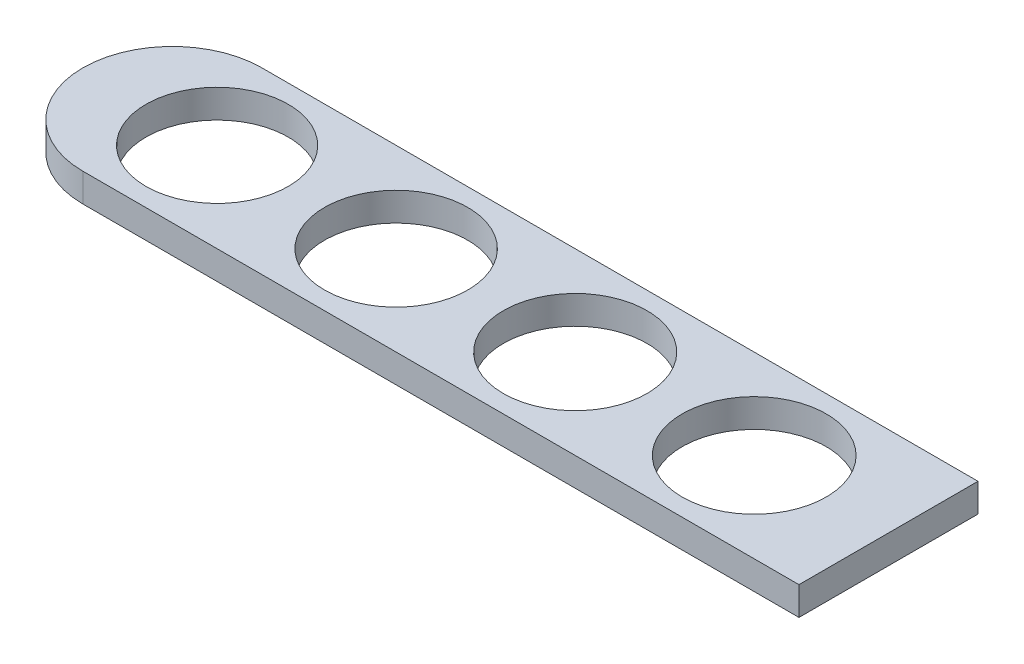
ISO-10303-21;
HEADER;
FILE_DESCRIPTION(('STEP AP214'),'2;1');
FILE_NAME('part.step','',(''),(''),'','','');
FILE_SCHEMA(('AUTOMOTIVE_DESIGN { 1 0 10303 214 1 1 1 1 }'));
ENDSEC;
DATA;
#1=APPLICATION_CONTEXT('core data for automotive mechanical design processes');
#2=APPLICATION_PROTOCOL_DEFINITION('international standard','automotive_design',2000,#1);
#3=PRODUCT_CONTEXT('',#1,'mechanical');
#4=PRODUCT('Part','Part','',(#3));
#5=PRODUCT_RELATED_PRODUCT_CATEGORY('part','',(#4));
#6=PRODUCT_DEFINITION_FORMATION('','',#4);
#7=PRODUCT_DEFINITION_CONTEXT('part definition',#1,'design');
#8=PRODUCT_DEFINITION('design','',#6,#7);
#9=PRODUCT_DEFINITION_SHAPE('','',#8);
#10=(LENGTH_UNIT() NAMED_UNIT(*) SI_UNIT(.MILLI.,.METRE.));
#11=(NAMED_UNIT(*) PLANE_ANGLE_UNIT() SI_UNIT($,.RADIAN.));
#12=(NAMED_UNIT(*) SI_UNIT($,.STERADIAN.) SOLID_ANGLE_UNIT());
#13=UNCERTAINTY_MEASURE_WITH_UNIT(LENGTH_MEASURE(1.E-05),#10,'distance_accuracy_value','');
#14=(GEOMETRIC_REPRESENTATION_CONTEXT(3) GLOBAL_UNCERTAINTY_ASSIGNED_CONTEXT((#13)) GLOBAL_UNIT_ASSIGNED_CONTEXT((#10,
#11,#12)) REPRESENTATION_CONTEXT('',''));
#15=CARTESIAN_POINT('',(0.,0.,0.));
#16=DIRECTION('',(0.,0.,1.));
#17=DIRECTION('',(1.,0.,0.));
#18=AXIS2_PLACEMENT_3D('',#15,#16,#17);
#19=CARTESIAN_POINT('',(0.,3.175,0.));
#20=DIRECTION('',(0.,1.,0.));
#21=DIRECTION('',(0.,0.,1.));
#22=AXIS2_PLACEMENT_3D('',#19,#20,#21);
#23=PLANE('',#22);
#24=CARTESIAN_POINT('',(10.,3.175,0.));
#25=DIRECTION('',(0.,1.,0.));
#26=DIRECTION('',(0.,0.,1.));
#27=AXIS2_PLACEMENT_3D('',#24,#25,#26);
#28=CIRCLE('',#27,8.025);
#29=CARTESIAN_POINT('',(10.,3.175,8.025));
#30=VERTEX_POINT('',#29);
#31=EDGE_CURVE('E132',#30,#30,#28,.T.);
#32=ORIENTED_EDGE('',*,*,#31,.F.);
#33=EDGE_LOOP('',(#32));
#34=FACE_BOUND('',#33,.T.);
#35=CARTESIAN_POINT('',(-30.,3.175,0.));
#36=DIRECTION('',(0.,1.,0.));
#37=DIRECTION('',(0.,0.,1.));
#38=AXIS2_PLACEMENT_3D('',#35,#36,#37);
#39=CIRCLE('',#38,7.95);
#40=CARTESIAN_POINT('',(-30.,3.175,7.95));
#41=VERTEX_POINT('',#40);
#42=EDGE_CURVE('E144',#41,#41,#39,.T.);
#43=ORIENTED_EDGE('',*,*,#42,.F.);
#44=EDGE_LOOP('',(#43));
#45=FACE_BOUND('',#44,.T.);
#46=DIRECTION('',(-1.,0.,0.));
#47=VECTOR('',#46,1.);
#48=CARTESIAN_POINT('',(-45.,3.175,-10.));
#49=LINE('',#48,#47);
#50=CARTESIAN_POINT('',(45.,3.175,-10.));
#51=VERTEX_POINT('',#50);
#52=CARTESIAN_POINT('',(-35.,3.175,-10.));
#53=VERTEX_POINT('',#52);
#54=EDGE_CURVE('E76',#51,#53,#49,.T.);
#55=ORIENTED_EDGE('',*,*,#54,.T.);
#56=CARTESIAN_POINT('',(-35.,3.175,0.));
#57=DIRECTION('',(0.,1.,0.));
#58=DIRECTION('',(0.,0.,1.));
#59=AXIS2_PLACEMENT_3D('',#56,#57,#58);
#60=CIRCLE('',#59,10.);
#61=CARTESIAN_POINT('',(-45.,3.175,0.));
#62=VERTEX_POINT('',#61);
#63=EDGE_CURVE('E41',#53,#62,#60,.T.);
#64=ORIENTED_EDGE('',*,*,#63,.T.);
#65=CARTESIAN_POINT('',(-35.,3.175,0.));
#66=DIRECTION('',(0.,1.,0.));
#67=DIRECTION('',(0.,0.,1.));
#68=AXIS2_PLACEMENT_3D('',#65,#66,#67);
#69=CIRCLE('',#68,10.);
#70=CARTESIAN_POINT('',(-35.,3.175,10.));
#71=VERTEX_POINT('',#70);
#72=EDGE_CURVE('E48',#62,#71,#69,.T.);
#73=ORIENTED_EDGE('',*,*,#72,.T.);
#74=DIRECTION('',(1.,0.,0.));
#75=VECTOR('',#74,1.);
#76=CARTESIAN_POINT('',(-45.,3.175,10.));
#77=LINE('',#76,#75);
#78=CARTESIAN_POINT('',(45.,3.175,10.));
#79=VERTEX_POINT('',#78);
#80=EDGE_CURVE('E85',#71,#79,#77,.T.);
#81=ORIENTED_EDGE('',*,*,#80,.T.);
#82=DIRECTION('',(0.,0.,-1.));
#83=VECTOR('',#82,1.);
#84=CARTESIAN_POINT('',(45.,3.175,-10.));
#85=LINE('',#84,#83);
#86=EDGE_CURVE('E86',#79,#51,#85,.T.);
#87=ORIENTED_EDGE('',*,*,#86,.T.);
#88=EDGE_LOOP('',(#55,#64,#73,#81,#87));
#89=FACE_BOUND('',#88,.T.);
#90=CARTESIAN_POINT('',(-10.,3.175,0.));
#91=DIRECTION('',(0.,1.,0.));
#92=DIRECTION('',(0.,0.,1.));
#93=AXIS2_PLACEMENT_3D('',#90,#91,#92);
#94=CIRCLE('',#93,8.);
#95=CARTESIAN_POINT('',(-10.,3.175,8.));
#96=VERTEX_POINT('',#95);
#97=EDGE_CURVE('E138',#96,#96,#94,.T.);
#98=ORIENTED_EDGE('',*,*,#97,.F.);
#99=EDGE_LOOP('',(#98));
#100=FACE_BOUND('',#99,.T.);
#101=CARTESIAN_POINT('',(30.,3.175,0.));
#102=DIRECTION('',(0.,1.,0.));
#103=DIRECTION('',(0.,0.,1.));
#104=AXIS2_PLACEMENT_3D('',#101,#102,#103);
#105=CIRCLE('',#104,8.05);
#106=CARTESIAN_POINT('',(30.,3.175,8.05));
#107=VERTEX_POINT('',#106);
#108=EDGE_CURVE('E124',#107,#107,#105,.T.);
#109=ORIENTED_EDGE('',*,*,#108,.F.);
#110=EDGE_LOOP('',(#109));
#111=FACE_BOUND('',#110,.T.);
#112=ADVANCED_FACE('F32',(#34,#45,#89,#100,#111),#23,.T.);
#113=CARTESIAN_POINT('',(0.,0.,0.));
#114=DIRECTION('',(0.,1.,0.));
#115=DIRECTION('',(0.,0.,1.));
#116=AXIS2_PLACEMENT_3D('',#113,#114,#115);
#117=PLANE('',#116);
#118=CARTESIAN_POINT('',(-35.,0.,0.));
#119=DIRECTION('',(0.,1.,0.));
#120=DIRECTION('',(0.,0.,1.));
#121=AXIS2_PLACEMENT_3D('',#118,#119,#120);
#122=CIRCLE('',#121,10.);
#123=CARTESIAN_POINT('',(-35.,0.,10.));
#124=VERTEX_POINT('',#123);
#125=CARTESIAN_POINT('',(-45.,0.,0.));
#126=VERTEX_POINT('',#125);
#127=EDGE_CURVE('E98',#124,#126,#122,.F.);
#128=ORIENTED_EDGE('',*,*,#127,.T.);
#129=CARTESIAN_POINT('',(-35.,0.,0.));
#130=DIRECTION('',(0.,1.,0.));
#131=DIRECTION('',(0.,0.,1.));
#132=AXIS2_PLACEMENT_3D('',#129,#130,#131);
#133=CIRCLE('',#132,10.);
#134=CARTESIAN_POINT('',(-35.,0.,-10.));
#135=VERTEX_POINT('',#134);
#136=EDGE_CURVE('E101',#126,#135,#133,.F.);
#137=ORIENTED_EDGE('',*,*,#136,.T.);
#138=DIRECTION('',(-1.,0.,0.));
#139=VECTOR('',#138,1.);
#140=CARTESIAN_POINT('',(-45.,0.,-10.));
#141=LINE('',#140,#139);
#142=CARTESIAN_POINT('',(45.,0.,-10.));
#143=VERTEX_POINT('',#142);
#144=EDGE_CURVE('E113',#143,#135,#141,.T.);
#145=ORIENTED_EDGE('',*,*,#144,.F.);
#146=DIRECTION('',(0.,0.,-1.));
#147=VECTOR('',#146,1.);
#148=CARTESIAN_POINT('',(45.,0.,-10.));
#149=LINE('',#148,#147);
#150=CARTESIAN_POINT('',(45.,0.,10.));
#151=VERTEX_POINT('',#150);
#152=EDGE_CURVE('E97',#151,#143,#149,.T.);
#153=ORIENTED_EDGE('',*,*,#152,.F.);
#154=DIRECTION('',(1.,0.,0.));
#155=VECTOR('',#154,1.);
#156=CARTESIAN_POINT('',(-45.,0.,10.));
#157=LINE('',#156,#155);
#158=EDGE_CURVE('E93',#124,#151,#157,.T.);
#159=ORIENTED_EDGE('',*,*,#158,.F.);
#160=EDGE_LOOP('',(#128,#137,#145,#153,#159));
#161=FACE_BOUND('',#160,.T.);
#162=CARTESIAN_POINT('',(-30.,0.,0.));
#163=DIRECTION('',(0.,1.,0.));
#164=DIRECTION('',(0.,0.,1.));
#165=AXIS2_PLACEMENT_3D('',#162,#163,#164);
#166=CIRCLE('',#165,7.95);
#167=CARTESIAN_POINT('',(-30.,0.,7.95));
#168=VERTEX_POINT('',#167);
#169=EDGE_CURVE('E141',#168,#168,#166,.T.);
#170=ORIENTED_EDGE('',*,*,#169,.T.);
#171=EDGE_LOOP('',(#170));
#172=FACE_BOUND('',#171,.T.);
#173=CARTESIAN_POINT('',(-10.,0.,0.));
#174=DIRECTION('',(0.,1.,0.));
#175=DIRECTION('',(0.,0.,1.));
#176=AXIS2_PLACEMENT_3D('',#173,#174,#175);
#177=CIRCLE('',#176,8.);
#178=CARTESIAN_POINT('',(-10.,0.,8.));
#179=VERTEX_POINT('',#178);
#180=EDGE_CURVE('E135',#179,#179,#177,.T.);
#181=ORIENTED_EDGE('',*,*,#180,.T.);
#182=EDGE_LOOP('',(#181));
#183=FACE_BOUND('',#182,.T.);
#184=CARTESIAN_POINT('',(10.,0.,0.));
#185=DIRECTION('',(0.,1.,0.));
#186=DIRECTION('',(0.,0.,1.));
#187=AXIS2_PLACEMENT_3D('',#184,#185,#186);
#188=CIRCLE('',#187,8.025);
#189=CARTESIAN_POINT('',(10.,0.,8.025));
#190=VERTEX_POINT('',#189);
#191=EDGE_CURVE('E129',#190,#190,#188,.T.);
#192=ORIENTED_EDGE('',*,*,#191,.T.);
#193=EDGE_LOOP('',(#192));
#194=FACE_BOUND('',#193,.T.);
#195=CARTESIAN_POINT('',(30.,0.,0.));
#196=DIRECTION('',(0.,1.,0.));
#197=DIRECTION('',(0.,0.,1.));
#198=AXIS2_PLACEMENT_3D('',#195,#196,#197);
#199=CIRCLE('',#198,8.05);
#200=CARTESIAN_POINT('',(30.,0.,8.05));
#201=VERTEX_POINT('',#200);
#202=EDGE_CURVE('E122',#201,#201,#199,.T.);
#203=ORIENTED_EDGE('',*,*,#202,.T.);
#204=EDGE_LOOP('',(#203));
#205=FACE_BOUND('',#204,.T.);
#206=ADVANCED_FACE('F111',(#161,#172,#183,#194,#205),#117,.F.);
#207=CARTESIAN_POINT('',(45.,3.175,-10.));
#208=DIRECTION('',(-1.,0.,0.));
#209=DIRECTION('',(0.,0.,1.));
#210=AXIS2_PLACEMENT_3D('',#207,#208,#209);
#211=PLANE('',#210);
#212=ORIENTED_EDGE('',*,*,#152,.T.);
#213=DIRECTION('',(0.,-1.,0.));
#214=VECTOR('',#213,1.);
#215=CARTESIAN_POINT('',(45.,3.175,-10.));
#216=LINE('',#215,#214);
#217=EDGE_CURVE('E81',#51,#143,#216,.T.);
#218=ORIENTED_EDGE('',*,*,#217,.F.);
#219=ORIENTED_EDGE('',*,*,#86,.F.);
#220=DIRECTION('',(0.,-1.,0.));
#221=VECTOR('',#220,1.);
#222=CARTESIAN_POINT('',(45.,3.175,10.));
#223=LINE('',#222,#221);
#224=EDGE_CURVE('E99',#79,#151,#223,.T.);
#225=ORIENTED_EDGE('',*,*,#224,.T.);
#226=EDGE_LOOP('',(#212,#218,#219,#225));
#227=FACE_BOUND('',#226,.T.);
#228=ADVANCED_FACE('F95',(#227),#211,.F.);
#229=CARTESIAN_POINT('',(-45.,3.175,-10.));
#230=DIRECTION('',(0.,0.,1.));
#231=DIRECTION('',(1.,0.,0.));
#232=AXIS2_PLACEMENT_3D('',#229,#230,#231);
#233=PLANE('',#232);
#234=ORIENTED_EDGE('',*,*,#144,.T.);
#235=DIRECTION('',(0.,-1.,0.));
#236=VECTOR('',#235,1.);
#237=CARTESIAN_POINT('',(-35.,3.175,-10.));
#238=LINE('',#237,#236);
#239=EDGE_CURVE('E84',#135,#53,#238,.F.);
#240=ORIENTED_EDGE('',*,*,#239,.T.);
#241=ORIENTED_EDGE('',*,*,#54,.F.);
#242=ORIENTED_EDGE('',*,*,#217,.T.);
#243=EDGE_LOOP('',(#234,#240,#241,#242));
#244=FACE_BOUND('',#243,.T.);
#245=ADVANCED_FACE('F79',(#244),#233,.F.);
#246=CARTESIAN_POINT('',(-45.,3.175,10.));
#247=DIRECTION('',(0.,0.,-1.));
#248=DIRECTION('',(-1.,0.,0.));
#249=AXIS2_PLACEMENT_3D('',#246,#247,#248);
#250=PLANE('',#249);
#251=ORIENTED_EDGE('',*,*,#80,.F.);
#252=DIRECTION('',(0.,-1.,0.));
#253=VECTOR('',#252,1.);
#254=CARTESIAN_POINT('',(-35.,3.175,10.));
#255=LINE('',#254,#253);
#256=EDGE_CURVE('E11',#71,#124,#255,.T.);
#257=ORIENTED_EDGE('',*,*,#256,.T.);
#258=ORIENTED_EDGE('',*,*,#158,.T.);
#259=ORIENTED_EDGE('',*,*,#224,.F.);
#260=EDGE_LOOP('',(#251,#257,#258,#259));
#261=FACE_BOUND('',#260,.T.);
#262=ADVANCED_FACE('F151',(#261),#250,.F.);
#263=CARTESIAN_POINT('',(-30.,3.175,0.));
#264=DIRECTION('',(0.,-1.,0.));
#265=DIRECTION('',(0.,0.,-1.));
#266=AXIS2_PLACEMENT_3D('',#263,#264,#265);
#267=CYLINDRICAL_SURFACE('',#266,7.95);
#268=ORIENTED_EDGE('',*,*,#42,.T.);
#269=EDGE_LOOP('',(#268));
#270=FACE_BOUND('',#269,.T.);
#271=ORIENTED_EDGE('',*,*,#169,.F.);
#272=EDGE_LOOP('',(#271));
#273=FACE_BOUND('',#272,.T.);
#274=ADVANCED_FACE('F172',(#270,#273),#267,.F.);
#275=CARTESIAN_POINT('',(-10.,3.175,0.));
#276=DIRECTION('',(0.,-1.,0.));
#277=DIRECTION('',(0.,0.,-1.));
#278=AXIS2_PLACEMENT_3D('',#275,#276,#277);
#279=CYLINDRICAL_SURFACE('',#278,8.);
#280=ORIENTED_EDGE('',*,*,#97,.T.);
#281=EDGE_LOOP('',(#280));
#282=FACE_BOUND('',#281,.T.);
#283=ORIENTED_EDGE('',*,*,#180,.F.);
#284=EDGE_LOOP('',(#283));
#285=FACE_BOUND('',#284,.T.);
#286=ADVANCED_FACE('F198',(#282,#285),#279,.F.);
#287=CARTESIAN_POINT('',(10.,3.175,0.));
#288=DIRECTION('',(0.,-1.,0.));
#289=DIRECTION('',(0.,0.,-1.));
#290=AXIS2_PLACEMENT_3D('',#287,#288,#289);
#291=CYLINDRICAL_SURFACE('',#290,8.025);
#292=ORIENTED_EDGE('',*,*,#31,.T.);
#293=EDGE_LOOP('',(#292));
#294=FACE_BOUND('',#293,.T.);
#295=ORIENTED_EDGE('',*,*,#191,.F.);
#296=EDGE_LOOP('',(#295));
#297=FACE_BOUND('',#296,.T.);
#298=ADVANCED_FACE('F159',(#294,#297),#291,.F.);
#299=CARTESIAN_POINT('',(30.,3.175,0.));
#300=DIRECTION('',(0.,-1.,0.));
#301=DIRECTION('',(0.,0.,-1.));
#302=AXIS2_PLACEMENT_3D('',#299,#300,#301);
#303=CYLINDRICAL_SURFACE('',#302,8.05);
#304=ORIENTED_EDGE('',*,*,#108,.T.);
#305=EDGE_LOOP('',(#304));
#306=FACE_BOUND('',#305,.T.);
#307=ORIENTED_EDGE('',*,*,#202,.F.);
#308=EDGE_LOOP('',(#307));
#309=FACE_BOUND('',#308,.T.);
#310=ADVANCED_FACE('F154',(#306,#309),#303,.F.);
#311=CARTESIAN_POINT('',(-35.,3.175,0.));
#312=DIRECTION('',(0.,-1.,0.));
#313=DIRECTION('',(0.,0.,-1.));
#314=AXIS2_PLACEMENT_3D('',#311,#312,#313);
#315=CYLINDRICAL_SURFACE('',#314,10.);
#316=ORIENTED_EDGE('',*,*,#256,.F.);
#317=ORIENTED_EDGE('',*,*,#72,.F.);
#318=DIRECTION('',(0.,-1.,0.));
#319=VECTOR('',#318,1.);
#320=CARTESIAN_POINT('',(-45.,3.175,0.));
#321=LINE('',#320,#319);
#322=EDGE_CURVE('E36',#126,#62,#321,.F.);
#323=ORIENTED_EDGE('',*,*,#322,.F.);
#324=ORIENTED_EDGE('',*,*,#127,.F.);
#325=EDGE_LOOP('',(#316,#317,#323,#324));
#326=FACE_BOUND('',#325,.T.);
#327=ADVANCED_FACE('F34',(#326),#315,.T.);
#328=CARTESIAN_POINT('',(-35.,3.175,0.));
#329=DIRECTION('',(0.,-1.,0.));
#330=DIRECTION('',(0.,0.,-1.));
#331=AXIS2_PLACEMENT_3D('',#328,#329,#330);
#332=CYLINDRICAL_SURFACE('',#331,10.);
#333=ORIENTED_EDGE('',*,*,#63,.F.);
#334=ORIENTED_EDGE('',*,*,#239,.F.);
#335=ORIENTED_EDGE('',*,*,#136,.F.);
#336=ORIENTED_EDGE('',*,*,#322,.T.);
#337=EDGE_LOOP('',(#333,#334,#335,#336));
#338=FACE_BOUND('',#337,.T.);
#339=ADVANCED_FACE('F120',(#338),#332,.T.);
#340=CLOSED_SHELL('',(#112,#206,#228,#245,#262,#274,#286,#298,#310,#327,#339));
#341=MANIFOLD_SOLID_BREP('B2',#340);
#342=ADVANCED_BREP_SHAPE_REPRESENTATION('',(#18,#341),#14);
#343=SHAPE_DEFINITION_REPRESENTATION(#9,#342);
ENDSEC;
END-ISO-10303-21;
